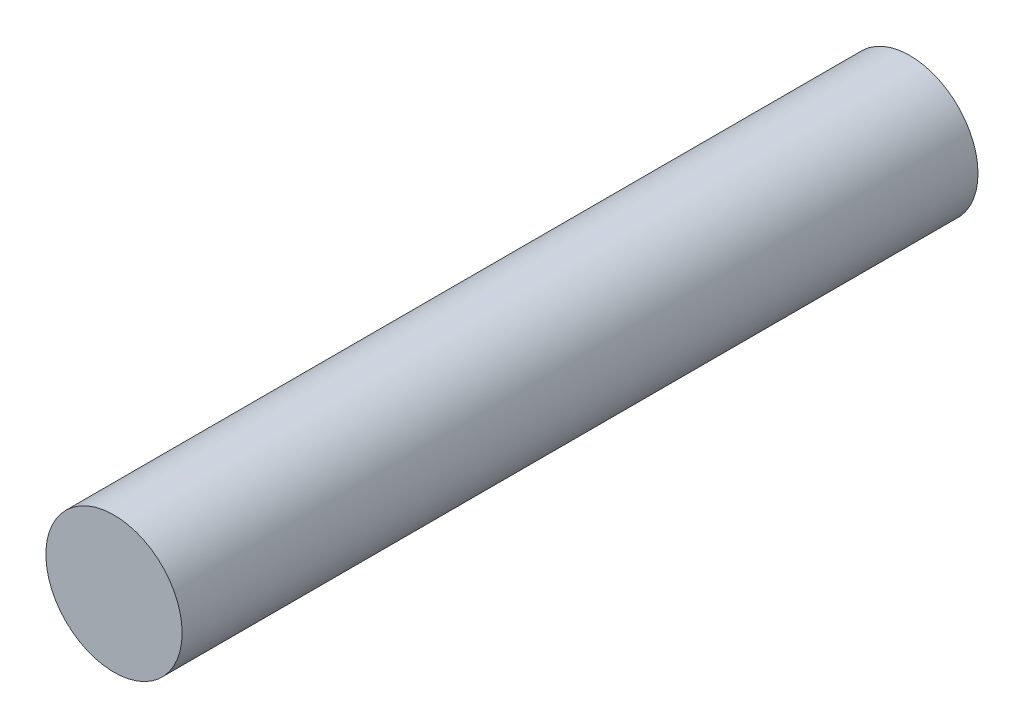
ISO-10303-21;
HEADER;
FILE_DESCRIPTION(('STEP AP214'),'2;1');
FILE_NAME('part.step','',(''),(''),'','','');
FILE_SCHEMA(('AUTOMOTIVE_DESIGN { 1 0 10303 214 1 1 1 1 }'));
ENDSEC;
DATA;
#1=APPLICATION_CONTEXT('core data for automotive mechanical design processes');
#2=APPLICATION_PROTOCOL_DEFINITION('international standard','automotive_design',2000,#1);
#3=PRODUCT_CONTEXT('',#1,'mechanical');
#4=PRODUCT('Part','Part','',(#3));
#5=PRODUCT_RELATED_PRODUCT_CATEGORY('part','',(#4));
#6=PRODUCT_DEFINITION_FORMATION('','',#4);
#7=PRODUCT_DEFINITION_CONTEXT('part definition',#1,'design');
#8=PRODUCT_DEFINITION('design','',#6,#7);
#9=PRODUCT_DEFINITION_SHAPE('','',#8);
#10=(LENGTH_UNIT() NAMED_UNIT(*) SI_UNIT(.MILLI.,.METRE.));
#11=(NAMED_UNIT(*) PLANE_ANGLE_UNIT() SI_UNIT($,.RADIAN.));
#12=(NAMED_UNIT(*) SI_UNIT($,.STERADIAN.) SOLID_ANGLE_UNIT());
#13=UNCERTAINTY_MEASURE_WITH_UNIT(LENGTH_MEASURE(1.E-05),#10,'distance_accuracy_value','');
#14=(GEOMETRIC_REPRESENTATION_CONTEXT(3) GLOBAL_UNCERTAINTY_ASSIGNED_CONTEXT((#13)) GLOBAL_UNIT_ASSIGNED_CONTEXT((#10,
#11,#12)) REPRESENTATION_CONTEXT('',''));
#15=CARTESIAN_POINT('',(0.,0.,0.));
#16=DIRECTION('',(0.,0.,1.));
#17=DIRECTION('',(1.,0.,0.));
#18=AXIS2_PLACEMENT_3D('',#15,#16,#17);
#19=CARTESIAN_POINT('',(0.,0.,15.875));
#20=DIRECTION('',(0.,0.,-1.));
#21=DIRECTION('',(-1.,0.,0.));
#22=AXIS2_PLACEMENT_3D('',#19,#20,#21);
#23=CYLINDRICAL_SURFACE('',#22,1.3589);
#24=CARTESIAN_POINT('',(0.,0.,15.875));
#25=DIRECTION('',(0.,0.,1.));
#26=DIRECTION('',(1.,0.,0.));
#27=AXIS2_PLACEMENT_3D('',#24,#25,#26);
#28=CIRCLE('',#27,1.3589);
#29=CARTESIAN_POINT('',(1.3589,0.,15.875));
#30=VERTEX_POINT('',#29);
#31=EDGE_CURVE('E10',#30,#30,#28,.T.);
#32=ORIENTED_EDGE('',*,*,#31,.F.);
#33=EDGE_LOOP('',(#32));
#34=FACE_BOUND('',#33,.T.);
#35=CARTESIAN_POINT('',(0.,0.,0.));
#36=DIRECTION('',(0.,0.,1.));
#37=DIRECTION('',(1.,0.,0.));
#38=AXIS2_PLACEMENT_3D('',#35,#36,#37);
#39=CIRCLE('',#38,1.3589);
#40=CARTESIAN_POINT('',(1.3589,0.,0.));
#41=VERTEX_POINT('',#40);
#42=EDGE_CURVE('E40',#41,#41,#39,.T.);
#43=ORIENTED_EDGE('',*,*,#42,.T.);
#44=EDGE_LOOP('',(#43));
#45=FACE_BOUND('',#44,.T.);
#46=ADVANCED_FACE('F37',(#34,#45),#23,.T.);
#47=CARTESIAN_POINT('',(0.,0.,15.875));
#48=DIRECTION('',(0.,0.,1.));
#49=DIRECTION('',(1.,0.,0.));
#50=AXIS2_PLACEMENT_3D('',#47,#48,#49);
#51=PLANE('',#50);
#52=ORIENTED_EDGE('',*,*,#31,.T.);
#53=EDGE_LOOP('',(#52));
#54=FACE_BOUND('',#53,.T.);
#55=ADVANCED_FACE('F54',(#54),#51,.T.);
#56=CARTESIAN_POINT('',(0.,0.,0.));
#57=DIRECTION('',(0.,0.,1.));
#58=DIRECTION('',(1.,0.,0.));
#59=AXIS2_PLACEMENT_3D('',#56,#57,#58);
#60=PLANE('',#59);
#61=ORIENTED_EDGE('',*,*,#42,.F.);
#62=EDGE_LOOP('',(#61));
#63=FACE_BOUND('',#62,.T.);
#64=ADVANCED_FACE('F52',(#63),#60,.F.);
#65=CLOSED_SHELL('',(#46,#55,#64));
#66=MANIFOLD_SOLID_BREP('B2',#65);
#67=ADVANCED_BREP_SHAPE_REPRESENTATION('',(#18,#66),#14);
#68=SHAPE_DEFINITION_REPRESENTATION(#9,#67);
ENDSEC;
END-ISO-10303-21;
